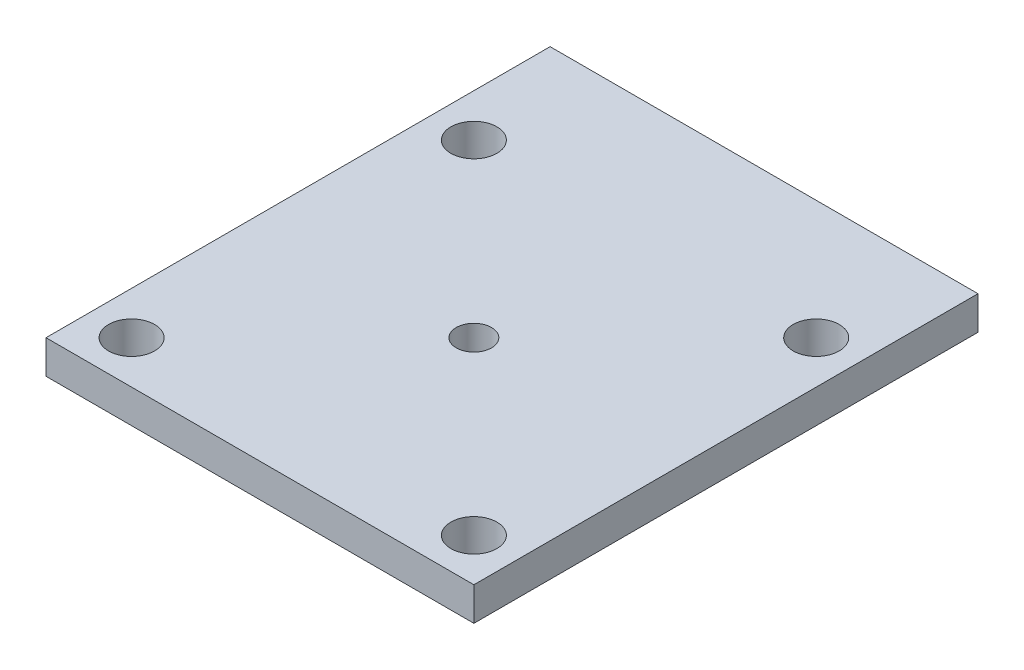
ISO-10303-21;
HEADER;
FILE_DESCRIPTION(('STEP AP214'),'2;1');
FILE_NAME('part.step','',(''),(''),'','','');
FILE_SCHEMA(('AUTOMOTIVE_DESIGN { 1 0 10303 214 1 1 1 1 }'));
ENDSEC;
DATA;
#1=APPLICATION_CONTEXT('core data for automotive mechanical design processes');
#2=APPLICATION_PROTOCOL_DEFINITION('international standard','automotive_design',2000,#1);
#3=PRODUCT_CONTEXT('',#1,'mechanical');
#4=PRODUCT('Part','Part','',(#3));
#5=PRODUCT_RELATED_PRODUCT_CATEGORY('part','',(#4));
#6=PRODUCT_DEFINITION_FORMATION('','',#4);
#7=PRODUCT_DEFINITION_CONTEXT('part definition',#1,'design');
#8=PRODUCT_DEFINITION('design','',#6,#7);
#9=PRODUCT_DEFINITION_SHAPE('','',#8);
#10=(LENGTH_UNIT() NAMED_UNIT(*) SI_UNIT(.MILLI.,.METRE.));
#11=(NAMED_UNIT(*) PLANE_ANGLE_UNIT() SI_UNIT($,.RADIAN.));
#12=(NAMED_UNIT(*) SI_UNIT($,.STERADIAN.) SOLID_ANGLE_UNIT());
#13=UNCERTAINTY_MEASURE_WITH_UNIT(LENGTH_MEASURE(1.E-05),#10,'distance_accuracy_value','');
#14=(GEOMETRIC_REPRESENTATION_CONTEXT(3) GLOBAL_UNCERTAINTY_ASSIGNED_CONTEXT((#13)) GLOBAL_UNIT_ASSIGNED_CONTEXT((#10,
#11,#12)) REPRESENTATION_CONTEXT('',''));
#15=CARTESIAN_POINT('',(0.,0.,0.));
#16=DIRECTION('',(0.,0.,1.));
#17=DIRECTION('',(1.,0.,0.));
#18=AXIS2_PLACEMENT_3D('',#15,#16,#17);
#19=CARTESIAN_POINT('',(0.,0.,0.));
#20=DIRECTION('',(0.,-1.,0.));
#21=DIRECTION('',(0.,0.,-1.));
#22=AXIS2_PLACEMENT_3D('',#19,#20,#21);
#23=PLANE('',#22);
#24=CARTESIAN_POINT('',(0.,0.,3.5625));
#25=DIRECTION('',(0.,1.,0.));
#26=DIRECTION('',(0.,0.,1.));
#27=AXIS2_PLACEMENT_3D('',#24,#25,#26);
#28=CIRCLE('',#27,1.65);
#29=CARTESIAN_POINT('',(0.,0.,5.2125));
#30=VERTEX_POINT('',#29);
#31=EDGE_CURVE('E144',#30,#30,#28,.T.);
#32=ORIENTED_EDGE('',*,*,#31,.T.);
#33=EDGE_LOOP('',(#32));
#34=FACE_BOUND('',#33,.T.);
#35=CARTESIAN_POINT('',(16.,0.,19.5625));
#36=DIRECTION('',(0.,1.,0.));
#37=DIRECTION('',(0.,0.,1.));
#38=AXIS2_PLACEMENT_3D('',#35,#36,#37);
#39=CIRCLE('',#38,2.15);
#40=CARTESIAN_POINT('',(16.,0.,21.7125));
#41=VERTEX_POINT('',#40);
#42=EDGE_CURVE('E138',#41,#41,#39,.T.);
#43=ORIENTED_EDGE('',*,*,#42,.T.);
#44=EDGE_LOOP('',(#43));
#45=FACE_BOUND('',#44,.T.);
#46=CARTESIAN_POINT('',(-16.,0.,19.5625));
#47=DIRECTION('',(0.,1.,0.));
#48=DIRECTION('',(0.,0.,1.));
#49=AXIS2_PLACEMENT_3D('',#46,#47,#48);
#50=CIRCLE('',#49,2.15);
#51=CARTESIAN_POINT('',(-16.,0.,21.7125));
#52=VERTEX_POINT('',#51);
#53=EDGE_CURVE('E132',#52,#52,#50,.T.);
#54=ORIENTED_EDGE('',*,*,#53,.T.);
#55=EDGE_LOOP('',(#54));
#56=FACE_BOUND('',#55,.T.);
#57=CARTESIAN_POINT('',(-16.,0.,-12.4375));
#58=DIRECTION('',(0.,1.,0.));
#59=DIRECTION('',(0.,0.,1.));
#60=AXIS2_PLACEMENT_3D('',#57,#58,#59);
#61=CIRCLE('',#60,2.15);
#62=CARTESIAN_POINT('',(-16.,0.,-10.2875));
#63=VERTEX_POINT('',#62);
#64=EDGE_CURVE('E126',#63,#63,#61,.T.);
#65=ORIENTED_EDGE('',*,*,#64,.T.);
#66=EDGE_LOOP('',(#65));
#67=FACE_BOUND('',#66,.T.);
#68=DIRECTION('',(0.,0.,-1.));
#69=VECTOR('',#68,1.);
#70=CARTESIAN_POINT('',(20.,0.,23.5625));
#71=LINE('',#70,#69);
#72=CARTESIAN_POINT('',(20.,0.,23.5625));
#73=VERTEX_POINT('',#72);
#74=CARTESIAN_POINT('',(20.,0.,-23.5625));
#75=VERTEX_POINT('',#74);
#76=EDGE_CURVE('E107',#73,#75,#71,.T.);
#77=ORIENTED_EDGE('',*,*,#76,.F.);
#78=DIRECTION('',(1.,0.,0.));
#79=VECTOR('',#78,1.);
#80=CARTESIAN_POINT('',(-20.,0.,23.5625));
#81=LINE('',#80,#79);
#82=CARTESIAN_POINT('',(-20.,0.,23.5625));
#83=VERTEX_POINT('',#82);
#84=EDGE_CURVE('E83',#83,#73,#81,.T.);
#85=ORIENTED_EDGE('',*,*,#84,.F.);
#86=DIRECTION('',(0.,0.,1.));
#87=VECTOR('',#86,1.);
#88=CARTESIAN_POINT('',(-20.,0.,23.5625));
#89=LINE('',#88,#87);
#90=CARTESIAN_POINT('',(-20.,0.,-23.5625));
#91=VERTEX_POINT('',#90);
#92=EDGE_CURVE('E77',#91,#83,#89,.T.);
#93=ORIENTED_EDGE('',*,*,#92,.F.);
#94=DIRECTION('',(-1.,0.,0.));
#95=VECTOR('',#94,1.);
#96=CARTESIAN_POINT('',(-20.,0.,-23.5625));
#97=LINE('',#96,#95);
#98=EDGE_CURVE('E99',#75,#91,#97,.T.);
#99=ORIENTED_EDGE('',*,*,#98,.F.);
#100=EDGE_LOOP('',(#77,#85,#93,#99));
#101=FACE_BOUND('',#100,.T.);
#102=CARTESIAN_POINT('',(16.,0.,-12.4375));
#103=DIRECTION('',(0.,1.,0.));
#104=DIRECTION('',(0.,0.,1.));
#105=AXIS2_PLACEMENT_3D('',#102,#103,#104);
#106=CIRCLE('',#105,2.15);
#107=CARTESIAN_POINT('',(16.,0.,-10.2875));
#108=VERTEX_POINT('',#107);
#109=EDGE_CURVE('E110',#108,#108,#106,.T.);
#110=ORIENTED_EDGE('',*,*,#109,.T.);
#111=EDGE_LOOP('',(#110));
#112=FACE_BOUND('',#111,.T.);
#113=ADVANCED_FACE('F43',(#34,#45,#56,#67,#101,#112),#23,.T.);
#114=CARTESIAN_POINT('',(20.,3.125,23.5625));
#115=DIRECTION('',(-1.,0.,0.));
#116=DIRECTION('',(0.,0.,1.));
#117=AXIS2_PLACEMENT_3D('',#114,#115,#116);
#118=PLANE('',#117);
#119=ORIENTED_EDGE('',*,*,#76,.T.);
#120=DIRECTION('',(0.,-1.,0.));
#121=VECTOR('',#120,1.);
#122=CARTESIAN_POINT('',(20.,3.125,-23.5625));
#123=LINE('',#122,#121);
#124=CARTESIAN_POINT('',(20.,3.125,-23.5625));
#125=VERTEX_POINT('',#124);
#126=EDGE_CURVE('E11',#125,#75,#123,.T.);
#127=ORIENTED_EDGE('',*,*,#126,.F.);
#128=DIRECTION('',(0.,0.,-1.));
#129=VECTOR('',#128,1.);
#130=CARTESIAN_POINT('',(20.,3.125,23.5625));
#131=LINE('',#130,#129);
#132=CARTESIAN_POINT('',(20.,3.125,23.5625));
#133=VERTEX_POINT('',#132);
#134=EDGE_CURVE('E95',#133,#125,#131,.T.);
#135=ORIENTED_EDGE('',*,*,#134,.F.);
#136=DIRECTION('',(0.,-1.,0.));
#137=VECTOR('',#136,1.);
#138=CARTESIAN_POINT('',(20.,3.125,23.5625));
#139=LINE('',#138,#137);
#140=EDGE_CURVE('E103',#133,#73,#139,.T.);
#141=ORIENTED_EDGE('',*,*,#140,.T.);
#142=EDGE_LOOP('',(#119,#127,#135,#141));
#143=FACE_BOUND('',#142,.T.);
#144=ADVANCED_FACE('F45',(#143),#118,.F.);
#145=CARTESIAN_POINT('',(-20.,3.125,-23.5625));
#146=DIRECTION('',(0.,0.,1.));
#147=DIRECTION('',(1.,0.,0.));
#148=AXIS2_PLACEMENT_3D('',#145,#146,#147);
#149=PLANE('',#148);
#150=ORIENTED_EDGE('',*,*,#98,.T.);
#151=DIRECTION('',(0.,-1.,0.));
#152=VECTOR('',#151,1.);
#153=CARTESIAN_POINT('',(-20.,3.125,-23.5625));
#154=LINE('',#153,#152);
#155=CARTESIAN_POINT('',(-20.,3.125,-23.5625));
#156=VERTEX_POINT('',#155);
#157=EDGE_CURVE('E52',#156,#91,#154,.T.);
#158=ORIENTED_EDGE('',*,*,#157,.F.);
#159=DIRECTION('',(-1.,0.,0.));
#160=VECTOR('',#159,1.);
#161=CARTESIAN_POINT('',(-20.,3.125,-23.5625));
#162=LINE('',#161,#160);
#163=EDGE_CURVE('E90',#125,#156,#162,.T.);
#164=ORIENTED_EDGE('',*,*,#163,.F.);
#165=ORIENTED_EDGE('',*,*,#126,.T.);
#166=EDGE_LOOP('',(#150,#158,#164,#165));
#167=FACE_BOUND('',#166,.T.);
#168=ADVANCED_FACE('F98',(#167),#149,.F.);
#169=CARTESIAN_POINT('',(-20.,3.125,23.5625));
#170=DIRECTION('',(1.,0.,0.));
#171=DIRECTION('',(0.,0.,-1.));
#172=AXIS2_PLACEMENT_3D('',#169,#170,#171);
#173=PLANE('',#172);
#174=ORIENTED_EDGE('',*,*,#92,.T.);
#175=DIRECTION('',(0.,-1.,0.));
#176=VECTOR('',#175,1.);
#177=CARTESIAN_POINT('',(-20.,3.125,23.5625));
#178=LINE('',#177,#176);
#179=CARTESIAN_POINT('',(-20.,3.125,23.5625));
#180=VERTEX_POINT('',#179);
#181=EDGE_CURVE('E100',#180,#83,#178,.T.);
#182=ORIENTED_EDGE('',*,*,#181,.F.);
#183=DIRECTION('',(0.,0.,1.));
#184=VECTOR('',#183,1.);
#185=CARTESIAN_POINT('',(-20.,3.125,23.5625));
#186=LINE('',#185,#184);
#187=EDGE_CURVE('E93',#156,#180,#186,.T.);
#188=ORIENTED_EDGE('',*,*,#187,.F.);
#189=ORIENTED_EDGE('',*,*,#157,.T.);
#190=EDGE_LOOP('',(#174,#182,#188,#189));
#191=FACE_BOUND('',#190,.T.);
#192=ADVANCED_FACE('F101',(#191),#173,.F.);
#193=CARTESIAN_POINT('',(-20.,3.125,23.5625));
#194=DIRECTION('',(0.,0.,-1.));
#195=DIRECTION('',(-1.,0.,0.));
#196=AXIS2_PLACEMENT_3D('',#193,#194,#195);
#197=PLANE('',#196);
#198=ORIENTED_EDGE('',*,*,#84,.T.);
#199=ORIENTED_EDGE('',*,*,#140,.F.);
#200=DIRECTION('',(1.,0.,0.));
#201=VECTOR('',#200,1.);
#202=CARTESIAN_POINT('',(-20.,3.125,23.5625));
#203=LINE('',#202,#201);
#204=EDGE_CURVE('E60',#180,#133,#203,.T.);
#205=ORIENTED_EDGE('',*,*,#204,.F.);
#206=ORIENTED_EDGE('',*,*,#181,.T.);
#207=EDGE_LOOP('',(#198,#199,#205,#206));
#208=FACE_BOUND('',#207,.T.);
#209=ADVANCED_FACE('F115',(#208),#197,.F.);
#210=CARTESIAN_POINT('',(0.,3.125,0.));
#211=DIRECTION('',(0.,-1.,0.));
#212=DIRECTION('',(0.,0.,-1.));
#213=AXIS2_PLACEMENT_3D('',#210,#211,#212);
#214=PLANE('',#213);
#215=CARTESIAN_POINT('',(0.,3.125,3.5625));
#216=DIRECTION('',(0.,1.,0.));
#217=DIRECTION('',(0.,0.,1.));
#218=AXIS2_PLACEMENT_3D('',#215,#216,#217);
#219=CIRCLE('',#218,1.65);
#220=CARTESIAN_POINT('',(0.,3.125,5.2125));
#221=VERTEX_POINT('',#220);
#222=EDGE_CURVE('E147',#221,#221,#219,.T.);
#223=ORIENTED_EDGE('',*,*,#222,.F.);
#224=EDGE_LOOP('',(#223));
#225=FACE_BOUND('',#224,.T.);
#226=CARTESIAN_POINT('',(16.,3.125,19.5625));
#227=DIRECTION('',(0.,1.,0.));
#228=DIRECTION('',(0.,0.,1.));
#229=AXIS2_PLACEMENT_3D('',#226,#227,#228);
#230=CIRCLE('',#229,2.14999999999999);
#231=CARTESIAN_POINT('',(16.,3.125,21.7125));
#232=VERTEX_POINT('',#231);
#233=EDGE_CURVE('E141',#232,#232,#230,.T.);
#234=ORIENTED_EDGE('',*,*,#233,.F.);
#235=EDGE_LOOP('',(#234));
#236=FACE_BOUND('',#235,.T.);
#237=CARTESIAN_POINT('',(-16.,3.125,19.5625));
#238=DIRECTION('',(0.,1.,0.));
#239=DIRECTION('',(0.,0.,1.));
#240=AXIS2_PLACEMENT_3D('',#237,#238,#239);
#241=CIRCLE('',#240,2.14999999999999);
#242=CARTESIAN_POINT('',(-16.,3.125,21.7125));
#243=VERTEX_POINT('',#242);
#244=EDGE_CURVE('E135',#243,#243,#241,.T.);
#245=ORIENTED_EDGE('',*,*,#244,.F.);
#246=EDGE_LOOP('',(#245));
#247=FACE_BOUND('',#246,.T.);
#248=CARTESIAN_POINT('',(-16.,3.125,-12.4375));
#249=DIRECTION('',(0.,1.,0.));
#250=DIRECTION('',(0.,0.,1.));
#251=AXIS2_PLACEMENT_3D('',#248,#249,#250);
#252=CIRCLE('',#251,2.14999999999999);
#253=CARTESIAN_POINT('',(-16.,3.125,-10.2875));
#254=VERTEX_POINT('',#253);
#255=EDGE_CURVE('E129',#254,#254,#252,.T.);
#256=ORIENTED_EDGE('',*,*,#255,.F.);
#257=EDGE_LOOP('',(#256));
#258=FACE_BOUND('',#257,.T.);
#259=CARTESIAN_POINT('',(16.,3.125,-12.4375));
#260=DIRECTION('',(0.,1.,0.));
#261=DIRECTION('',(0.,0.,1.));
#262=AXIS2_PLACEMENT_3D('',#259,#260,#261);
#263=CIRCLE('',#262,2.14999999999999);
#264=CARTESIAN_POINT('',(16.,3.125,-10.2875));
#265=VERTEX_POINT('',#264);
#266=EDGE_CURVE('E123',#265,#265,#263,.T.);
#267=ORIENTED_EDGE('',*,*,#266,.F.);
#268=EDGE_LOOP('',(#267));
#269=FACE_BOUND('',#268,.T.);
#270=ORIENTED_EDGE('',*,*,#134,.T.);
#271=ORIENTED_EDGE('',*,*,#163,.T.);
#272=ORIENTED_EDGE('',*,*,#187,.T.);
#273=ORIENTED_EDGE('',*,*,#204,.T.);
#274=EDGE_LOOP('',(#270,#271,#272,#273));
#275=FACE_BOUND('',#274,.T.);
#276=ADVANCED_FACE('F91',(#225,#236,#247,#258,#269,#275),#214,.F.);
#277=CARTESIAN_POINT('',(16.,3.125,-12.4375));
#278=DIRECTION('',(0.,1.,0.));
#279=DIRECTION('',(0.,0.,1.));
#280=AXIS2_PLACEMENT_3D('',#277,#278,#279);
#281=CYLINDRICAL_SURFACE('',#280,2.14999999999999);
#282=ORIENTED_EDGE('',*,*,#109,.F.);
#283=EDGE_LOOP('',(#282));
#284=FACE_BOUND('',#283,.T.);
#285=ORIENTED_EDGE('',*,*,#266,.T.);
#286=EDGE_LOOP('',(#285));
#287=FACE_BOUND('',#286,.T.);
#288=ADVANCED_FACE('F155',(#284,#287),#281,.F.);
#289=CARTESIAN_POINT('',(-16.,3.125,-12.4375));
#290=DIRECTION('',(0.,1.,0.));
#291=DIRECTION('',(0.,0.,1.));
#292=AXIS2_PLACEMENT_3D('',#289,#290,#291);
#293=CYLINDRICAL_SURFACE('',#292,2.14999999999999);
#294=ORIENTED_EDGE('',*,*,#64,.F.);
#295=EDGE_LOOP('',(#294));
#296=FACE_BOUND('',#295,.T.);
#297=ORIENTED_EDGE('',*,*,#255,.T.);
#298=EDGE_LOOP('',(#297));
#299=FACE_BOUND('',#298,.T.);
#300=ADVANCED_FACE('F166',(#296,#299),#293,.F.);
#301=CARTESIAN_POINT('',(-16.,3.125,19.5625));
#302=DIRECTION('',(0.,1.,0.));
#303=DIRECTION('',(0.,0.,1.));
#304=AXIS2_PLACEMENT_3D('',#301,#302,#303);
#305=CYLINDRICAL_SURFACE('',#304,2.14999999999999);
#306=ORIENTED_EDGE('',*,*,#53,.F.);
#307=EDGE_LOOP('',(#306));
#308=FACE_BOUND('',#307,.T.);
#309=ORIENTED_EDGE('',*,*,#244,.T.);
#310=EDGE_LOOP('',(#309));
#311=FACE_BOUND('',#310,.T.);
#312=ADVANCED_FACE('F173',(#308,#311),#305,.F.);
#313=CARTESIAN_POINT('',(16.,3.125,19.5625));
#314=DIRECTION('',(0.,1.,0.));
#315=DIRECTION('',(0.,0.,1.));
#316=AXIS2_PLACEMENT_3D('',#313,#314,#315);
#317=CYLINDRICAL_SURFACE('',#316,2.14999999999999);
#318=ORIENTED_EDGE('',*,*,#42,.F.);
#319=EDGE_LOOP('',(#318));
#320=FACE_BOUND('',#319,.T.);
#321=ORIENTED_EDGE('',*,*,#233,.T.);
#322=EDGE_LOOP('',(#321));
#323=FACE_BOUND('',#322,.T.);
#324=ADVANCED_FACE('F235',(#320,#323),#317,.F.);
#325=CARTESIAN_POINT('',(0.,3.125,3.5625));
#326=DIRECTION('',(0.,1.,0.));
#327=DIRECTION('',(0.,0.,1.));
#328=AXIS2_PLACEMENT_3D('',#325,#326,#327);
#329=CYLINDRICAL_SURFACE('',#328,1.65);
#330=ORIENTED_EDGE('',*,*,#31,.F.);
#331=EDGE_LOOP('',(#330));
#332=FACE_BOUND('',#331,.T.);
#333=ORIENTED_EDGE('',*,*,#222,.T.);
#334=EDGE_LOOP('',(#333));
#335=FACE_BOUND('',#334,.T.);
#336=ADVANCED_FACE('F151',(#332,#335),#329,.F.);
#337=CLOSED_SHELL('',(#113,#144,#168,#192,#209,#276,#288,#300,#312,#324,#336));
#338=MANIFOLD_SOLID_BREP('B2',#337);
#339=ADVANCED_BREP_SHAPE_REPRESENTATION('',(#18,#338),#14);
#340=SHAPE_DEFINITION_REPRESENTATION(#9,#339);
ENDSEC;
END-ISO-10303-21;
